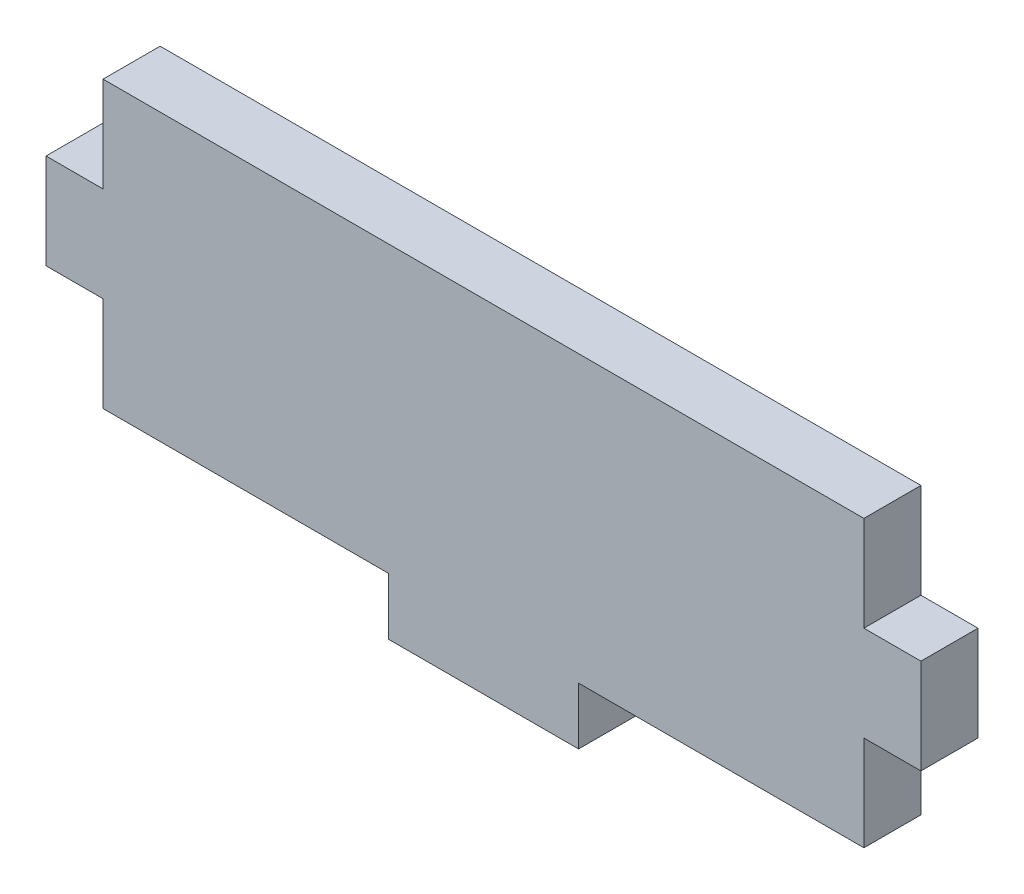
ISO-10303-21;
HEADER;
FILE_DESCRIPTION(('STEP AP214'),'2;1');
FILE_NAME('part.step','',(''),(''),'','','');
FILE_SCHEMA(('AUTOMOTIVE_DESIGN { 1 0 10303 214 1 1 1 1 }'));
ENDSEC;
DATA;
#1=APPLICATION_CONTEXT('core data for automotive mechanical design processes');
#2=APPLICATION_PROTOCOL_DEFINITION('international standard','automotive_design',2000,#1);
#3=PRODUCT_CONTEXT('',#1,'mechanical');
#4=PRODUCT('Part','Part','',(#3));
#5=PRODUCT_RELATED_PRODUCT_CATEGORY('part','',(#4));
#6=PRODUCT_DEFINITION_FORMATION('','',#4);
#7=PRODUCT_DEFINITION_CONTEXT('part definition',#1,'design');
#8=PRODUCT_DEFINITION('design','',#6,#7);
#9=PRODUCT_DEFINITION_SHAPE('','',#8);
#10=(LENGTH_UNIT() NAMED_UNIT(*) SI_UNIT(.MILLI.,.METRE.));
#11=(NAMED_UNIT(*) PLANE_ANGLE_UNIT() SI_UNIT($,.RADIAN.));
#12=(NAMED_UNIT(*) SI_UNIT($,.STERADIAN.) SOLID_ANGLE_UNIT());
#13=UNCERTAINTY_MEASURE_WITH_UNIT(LENGTH_MEASURE(1.E-05),#10,'distance_accuracy_value','');
#14=(GEOMETRIC_REPRESENTATION_CONTEXT(3) GLOBAL_UNCERTAINTY_ASSIGNED_CONTEXT((#13)) GLOBAL_UNIT_ASSIGNED_CONTEXT((#10,
#11,#12)) REPRESENTATION_CONTEXT('',''));
#15=CARTESIAN_POINT('',(0.,0.,0.));
#16=DIRECTION('',(0.,0.,1.));
#17=DIRECTION('',(1.,0.,0.));
#18=AXIS2_PLACEMENT_3D('',#15,#16,#17);
#19=CARTESIAN_POINT('',(-2.9999999944,-2.9999999944,2.9999999944));
#20=DIRECTION('',(0.,0.,1.));
#21=DIRECTION('',(1.,0.,0.));
#22=AXIS2_PLACEMENT_3D('',#19,#20,#21);
#23=PLANE('',#22);
#24=DIRECTION('',(1.,0.,0.));
#25=VECTOR('',#24,1.);
#26=CARTESIAN_POINT('',(20.000000005,14.9999999974,2.9999999944));
#27=LINE('',#26,#25);
#28=CARTESIAN_POINT('',(-4.23912933835563E-09,14.9999999974,2.9999999944));
#29=VERTEX_POINT('',#28);
#30=CARTESIAN_POINT('',(40.0000000142391,14.9999999974,2.9999999944));
#31=VERTEX_POINT('',#30);
#32=EDGE_CURVE('E186',#29,#31,#27,.T.);
#33=ORIENTED_EDGE('',*,*,#32,.F.);
#34=DIRECTION('',(0.,1.,0.));
#35=VECTOR('',#34,1.);
#36=CARTESIAN_POINT('',(0.,12.4999999936,2.9999999944));
#37=LINE('',#36,#35);
#38=CARTESIAN_POINT('',(-4.23912933835563E-09,9.99999999273889,2.9999999944));
#39=VERTEX_POINT('',#38);
#40=EDGE_CURVE('E190',#39,#29,#37,.T.);
#41=ORIENTED_EDGE('',*,*,#40,.F.);
#42=DIRECTION('',(1.,0.,0.));
#43=VECTOR('',#42,1.);
#44=CARTESIAN_POINT('',(-1.4999999972,9.9999999898,2.9999999944));
#45=LINE('',#44,#43);
#46=CARTESIAN_POINT('',(-2.9999999944,9.99999999273889,2.9999999944));
#47=VERTEX_POINT('',#46);
#48=EDGE_CURVE('E194',#47,#39,#45,.T.);
#49=ORIENTED_EDGE('',*,*,#48,.F.);
#50=DIRECTION('',(0.,1.,0.));
#51=VECTOR('',#50,1.);
#52=CARTESIAN_POINT('',(-2.9999999944,7.4999999987,2.9999999944));
#53=LINE('',#52,#51);
#54=CARTESIAN_POINT('',(-2.9999999944,5.00000000077778,2.9999999944));
#55=VERTEX_POINT('',#54);
#56=EDGE_CURVE('E198',#55,#47,#53,.T.);
#57=ORIENTED_EDGE('',*,*,#56,.F.);
#58=DIRECTION('',(-1.,0.,0.));
#59=VECTOR('',#58,1.);
#60=CARTESIAN_POINT('',(-1.4999999972,5.0000000076,2.9999999944));
#61=LINE('',#60,#59);
#62=CARTESIAN_POINT('',(-2.11956466917781E-09,5.00000000418889,2.9999999944));
#63=VERTEX_POINT('',#62);
#64=EDGE_CURVE('E143',#63,#55,#61,.T.);
#65=ORIENTED_EDGE('',*,*,#64,.F.);
#66=DIRECTION('',(0.,1.,0.));
#67=VECTOR('',#66,1.);
#68=CARTESIAN_POINT('',(0.,2.5000000038,2.9999999944));
#69=LINE('',#68,#67);
#70=CARTESIAN_POINT('',(-4.23912847099389E-09,5.11666609689237E-09,2.9999999944));
#71=VERTEX_POINT('',#70);
#72=EDGE_CURVE('E20',#71,#63,#69,.T.);
#73=ORIENTED_EDGE('',*,*,#72,.F.);
#74=DIRECTION('',(-1.,0.,0.));
#75=VECTOR('',#74,1.);
#76=CARTESIAN_POINT('',(7.4999999987,0.,2.9999999944));
#77=LINE('',#76,#75);
#78=CARTESIAN_POINT('',(15.0000000052652,5.11666696425411E-09,2.9999999944));
#79=VERTEX_POINT('',#78);
#80=EDGE_CURVE('E131',#79,#71,#77,.T.);
#81=ORIENTED_EDGE('',*,*,#80,.F.);
#82=DIRECTION('',(0.,1.,0.));
#83=VECTOR('',#82,1.);
#84=CARTESIAN_POINT('',(14.9999999974,-1.4999999972,2.9999999944));
#85=LINE('',#84,#83);
#86=CARTESIAN_POINT('',(15.0000000052652,-2.9999999944,2.9999999944));
#87=VERTEX_POINT('',#86);
#88=EDGE_CURVE('E126',#87,#79,#85,.T.);
#89=ORIENTED_EDGE('',*,*,#88,.F.);
#90=DIRECTION('',(-1.,0.,0.));
#91=VECTOR('',#90,1.);
#92=CARTESIAN_POINT('',(20.000000005,-2.9999999944,2.9999999944));
#93=LINE('',#92,#91);
#94=CARTESIAN_POINT('',(25.0000000047348,-2.9999999944,2.9999999944));
#95=VERTEX_POINT('',#94);
#96=EDGE_CURVE('E154',#95,#87,#93,.T.);
#97=ORIENTED_EDGE('',*,*,#96,.F.);
#98=DIRECTION('',(0.,-1.,0.));
#99=VECTOR('',#98,1.);
#100=CARTESIAN_POINT('',(25.0000000126,-1.4999999972,2.9999999944));
#101=LINE('',#100,#99);
#102=CARTESIAN_POINT('',(25.0000000047348,5.11666588005194E-09,2.9999999944));
#103=VERTEX_POINT('',#102);
#104=EDGE_CURVE('E158',#103,#95,#101,.T.);
#105=ORIENTED_EDGE('',*,*,#104,.F.);
#106=DIRECTION('',(-1.,0.,0.));
#107=VECTOR('',#106,1.);
#108=CARTESIAN_POINT('',(32.5000000113,0.,2.9999999944));
#109=LINE('',#108,#107);
#110=CARTESIAN_POINT('',(40.0000000142391,5.11666653057324E-09,2.9999999944));
#111=VERTEX_POINT('',#110);
#112=EDGE_CURVE('E162',#111,#103,#109,.T.);
#113=ORIENTED_EDGE('',*,*,#112,.F.);
#114=DIRECTION('',(0.,-1.,0.));
#115=VECTOR('',#114,1.);
#116=CARTESIAN_POINT('',(40.00000001,2.5000000038,2.9999999944));
#117=LINE('',#116,#115);
#118=CARTESIAN_POINT('',(40.0000000142391,5.00000000077778,2.9999999944));
#119=VERTEX_POINT('',#118);
#120=EDGE_CURVE('E166',#119,#111,#117,.T.);
#121=ORIENTED_EDGE('',*,*,#120,.F.);
#122=DIRECTION('',(-1.,0.,0.));
#123=VECTOR('',#122,1.);
#124=CARTESIAN_POINT('',(41.5000000072,5.0000000076,2.9999999944));
#125=LINE('',#124,#123);
#126=CARTESIAN_POINT('',(43.0000000044,5.00000000077778,2.9999999944));
#127=VERTEX_POINT('',#126);
#128=EDGE_CURVE('E170',#127,#119,#125,.T.);
#129=ORIENTED_EDGE('',*,*,#128,.F.);
#130=DIRECTION('',(0.,-1.,0.));
#131=VECTOR('',#130,1.);
#132=CARTESIAN_POINT('',(43.0000000044,7.4999999987,2.9999999944));
#133=LINE('',#132,#131);
#134=CARTESIAN_POINT('',(43.0000000044,9.99999999273889,2.9999999944));
#135=VERTEX_POINT('',#134);
#136=EDGE_CURVE('E174',#135,#127,#133,.T.);
#137=ORIENTED_EDGE('',*,*,#136,.F.);
#138=DIRECTION('',(1.,0.,0.));
#139=VECTOR('',#138,1.);
#140=CARTESIAN_POINT('',(41.5000000072,9.9999999898,2.9999999944));
#141=LINE('',#140,#139);
#142=CARTESIAN_POINT('',(40.0000000142391,9.99999999273889,2.9999999944));
#143=VERTEX_POINT('',#142);
#144=EDGE_CURVE('E178',#143,#135,#141,.T.);
#145=ORIENTED_EDGE('',*,*,#144,.F.);
#146=DIRECTION('',(0.,-1.,0.));
#147=VECTOR('',#146,1.);
#148=CARTESIAN_POINT('',(40.00000001,12.4999999936,2.9999999944));
#149=LINE('',#148,#147);
#150=EDGE_CURVE('E182',#31,#143,#149,.T.);
#151=ORIENTED_EDGE('',*,*,#150,.F.);
#152=EDGE_LOOP('',(#33,#41,#49,#57,#65,#73,#81,#89,#97,#105,#113,#121,#129,#137,#145,#151));
#153=FACE_BOUND('',#152,.T.);
#154=ADVANCED_FACE('F16',(#153),#23,.T.);
#155=CARTESIAN_POINT('',(0.,0.,0.));
#156=DIRECTION('',(-1.,0.,0.));
#157=DIRECTION('',(0.,0.,1.));
#158=AXIS2_PLACEMENT_3D('',#155,#156,#157);
#159=PLANE('',#158);
#160=ORIENTED_EDGE('',*,*,#72,.T.);
#161=DIRECTION('',(0.,0.,1.));
#162=VECTOR('',#161,1.);
#163=CARTESIAN_POINT('',(0.,5.0000000076,1.4999999972));
#164=LINE('',#163,#162);
#165=CARTESIAN_POINT('',(-2.11956423549695E-09,5.00000000418889,0.));
#166=VERTEX_POINT('',#165);
#167=EDGE_CURVE('E202',#166,#63,#164,.T.);
#168=ORIENTED_EDGE('',*,*,#167,.F.);
#169=DIRECTION('',(0.,-1.,0.));
#170=VECTOR('',#169,1.);
#171=CARTESIAN_POINT('',(-8.47826106195604E-09,6.0000000015,0.));
#172=LINE('',#171,#170);
#173=CARTESIAN_POINT('',(-2.11956423549695E-09,2.55833304844619E-09,0.));
#174=VERTEX_POINT('',#173);
#175=EDGE_CURVE('E149',#166,#174,#172,.T.);
#176=ORIENTED_EDGE('',*,*,#175,.T.);
#177=DIRECTION('',(0.,0.,-1.));
#178=VECTOR('',#177,1.);
#179=CARTESIAN_POINT('',(0.,0.,1.4999999972));
#180=LINE('',#179,#178);
#181=EDGE_CURVE('E136',#71,#174,#180,.T.);
#182=ORIENTED_EDGE('',*,*,#181,.F.);
#183=EDGE_LOOP('',(#160,#168,#176,#182));
#184=FACE_BOUND('',#183,.T.);
#185=ADVANCED_FACE('F148',(#184),#159,.T.);
#186=CARTESIAN_POINT('',(0.,0.,2.9999999944));
#187=DIRECTION('',(0.,-1.,0.));
#188=DIRECTION('',(0.,0.,-1.));
#189=AXIS2_PLACEMENT_3D('',#186,#187,#188);
#190=PLANE('',#189);
#191=ORIENTED_EDGE('',*,*,#80,.T.);
#192=ORIENTED_EDGE('',*,*,#181,.T.);
#193=DIRECTION('',(1.,0.,0.));
#194=VECTOR('',#193,1.);
#195=CARTESIAN_POINT('',(20.000000005,1.02333328443061E-08,0.));
#196=LINE('',#195,#194);
#197=CARTESIAN_POINT('',(15.0000000013326,2.55833348212706E-09,0.));
#198=VERTEX_POINT('',#197);
#199=EDGE_CURVE('E207',#174,#198,#196,.T.);
#200=ORIENTED_EDGE('',*,*,#199,.T.);
#201=DIRECTION('',(0.,0.,-1.));
#202=VECTOR('',#201,1.);
#203=CARTESIAN_POINT('',(14.9999999974,0.,1.4999999972));
#204=LINE('',#203,#202);
#205=EDGE_CURVE('E138',#79,#198,#204,.T.);
#206=ORIENTED_EDGE('',*,*,#205,.F.);
#207=EDGE_LOOP('',(#191,#192,#200,#206));
#208=FACE_BOUND('',#207,.T.);
#209=ADVANCED_FACE('F133',(#208),#190,.T.);
#210=CARTESIAN_POINT('',(14.9999999974,-2.9999999944,0.));
#211=DIRECTION('',(-1.,0.,0.));
#212=DIRECTION('',(0.,0.,1.));
#213=AXIS2_PLACEMENT_3D('',#210,#211,#212);
#214=PLANE('',#213);
#215=ORIENTED_EDGE('',*,*,#88,.T.);
#216=ORIENTED_EDGE('',*,*,#205,.T.);
#217=DIRECTION('',(0.,-1.,0.));
#218=VECTOR('',#217,1.);
#219=CARTESIAN_POINT('',(15.0000000131304,6.0000000015,0.));
#220=LINE('',#219,#218);
#221=CARTESIAN_POINT('',(15.0000000013326,-2.9999999944,0.));
#222=VERTEX_POINT('',#221);
#223=EDGE_CURVE('E209',#198,#222,#220,.T.);
#224=ORIENTED_EDGE('',*,*,#223,.T.);
#225=DIRECTION('',(0.,0.,-1.));
#226=VECTOR('',#225,1.);
#227=CARTESIAN_POINT('',(14.9999999974,-2.9999999944,1.4999999972));
#228=LINE('',#227,#226);
#229=EDGE_CURVE('E156',#87,#222,#228,.T.);
#230=ORIENTED_EDGE('',*,*,#229,.F.);
#231=EDGE_LOOP('',(#215,#216,#224,#230));
#232=FACE_BOUND('',#231,.T.);
#233=ADVANCED_FACE('F305',(#232),#214,.T.);
#234=CARTESIAN_POINT('',(14.9999999974,-2.9999999944,2.9999999944));
#235=DIRECTION('',(0.,-1.,0.));
#236=DIRECTION('',(0.,0.,-1.));
#237=AXIS2_PLACEMENT_3D('',#234,#235,#236);
#238=PLANE('',#237);
#239=ORIENTED_EDGE('',*,*,#96,.T.);
#240=ORIENTED_EDGE('',*,*,#229,.T.);
#241=DIRECTION('',(1.,0.,0.));
#242=VECTOR('',#241,1.);
#243=CARTESIAN_POINT('',(20.000000005,-2.9999999944,0.));
#244=LINE('',#243,#242);
#245=CARTESIAN_POINT('',(25.0000000086674,-2.9999999944,0.));
#246=VERTEX_POINT('',#245);
#247=EDGE_CURVE('E212',#222,#246,#244,.T.);
#248=ORIENTED_EDGE('',*,*,#247,.T.);
#249=DIRECTION('',(0.,0.,-1.));
#250=VECTOR('',#249,1.);
#251=CARTESIAN_POINT('',(25.0000000126,-2.9999999944,1.4999999972));
#252=LINE('',#251,#250);
#253=EDGE_CURVE('E160',#95,#246,#252,.T.);
#254=ORIENTED_EDGE('',*,*,#253,.F.);
#255=EDGE_LOOP('',(#239,#240,#248,#254));
#256=FACE_BOUND('',#255,.T.);
#257=ADVANCED_FACE('F304',(#256),#238,.T.);
#258=CARTESIAN_POINT('',(25.0000000126,-2.9999999944,2.9999999944));
#259=DIRECTION('',(1.,0.,0.));
#260=DIRECTION('',(0.,0.,-1.));
#261=AXIS2_PLACEMENT_3D('',#258,#259,#260);
#262=PLANE('',#261);
#263=ORIENTED_EDGE('',*,*,#104,.T.);
#264=ORIENTED_EDGE('',*,*,#253,.T.);
#265=DIRECTION('',(0.,1.,0.));
#266=VECTOR('',#265,1.);
#267=CARTESIAN_POINT('',(24.9999999968696,6.0000000015,0.));
#268=LINE('',#267,#266);
#269=CARTESIAN_POINT('',(25.0000000086674,2.55833294002597E-09,0.));
#270=VERTEX_POINT('',#269);
#271=EDGE_CURVE('E215',#246,#270,#268,.T.);
#272=ORIENTED_EDGE('',*,*,#271,.T.);
#273=DIRECTION('',(0.,0.,-1.));
#274=VECTOR('',#273,1.);
#275=CARTESIAN_POINT('',(25.0000000126,0.,1.4999999972));
#276=LINE('',#275,#274);
#277=EDGE_CURVE('E164',#103,#270,#276,.T.);
#278=ORIENTED_EDGE('',*,*,#277,.F.);
#279=EDGE_LOOP('',(#263,#264,#272,#278));
#280=FACE_BOUND('',#279,.T.);
#281=ADVANCED_FACE('F298',(#280),#262,.T.);
#282=CARTESIAN_POINT('',(25.0000000126,0.,2.9999999944));
#283=DIRECTION('',(0.,-1.,0.));
#284=DIRECTION('',(0.,0.,-1.));
#285=AXIS2_PLACEMENT_3D('',#282,#283,#284);
#286=PLANE('',#285);
#287=ORIENTED_EDGE('',*,*,#112,.T.);
#288=ORIENTED_EDGE('',*,*,#277,.T.);
#289=DIRECTION('',(1.,0.,0.));
#290=VECTOR('',#289,1.);
#291=CARTESIAN_POINT('',(20.000000005,1.02333328443061E-08,0.));
#292=LINE('',#291,#290);
#293=CARTESIAN_POINT('',(40.0000000121196,2.55833326528662E-09,0.));
#294=VERTEX_POINT('',#293);
#295=EDGE_CURVE('E218',#270,#294,#292,.T.);
#296=ORIENTED_EDGE('',*,*,#295,.T.);
#297=DIRECTION('',(0.,0.,-1.));
#298=VECTOR('',#297,1.);
#299=CARTESIAN_POINT('',(40.00000001,0.,1.4999999972));
#300=LINE('',#299,#298);
#301=EDGE_CURVE('E168',#111,#294,#300,.T.);
#302=ORIENTED_EDGE('',*,*,#301,.F.);
#303=EDGE_LOOP('',(#287,#288,#296,#302));
#304=FACE_BOUND('',#303,.T.);
#305=ADVANCED_FACE('F294',(#304),#286,.T.);
#306=CARTESIAN_POINT('',(40.00000001,0.,2.9999999944));
#307=DIRECTION('',(1.,0.,0.));
#308=DIRECTION('',(0.,0.,-1.));
#309=AXIS2_PLACEMENT_3D('',#306,#307,#308);
#310=PLANE('',#309);
#311=ORIENTED_EDGE('',*,*,#120,.T.);
#312=ORIENTED_EDGE('',*,*,#301,.T.);
#313=DIRECTION('',(0.,1.,0.));
#314=VECTOR('',#313,1.);
#315=CARTESIAN_POINT('',(40.0000000184783,6.0000000015,0.));
#316=LINE('',#315,#314);
#317=CARTESIAN_POINT('',(40.0000000121196,5.00000000418889,0.));
#318=VERTEX_POINT('',#317);
#319=EDGE_CURVE('E221',#294,#318,#316,.T.);
#320=ORIENTED_EDGE('',*,*,#319,.T.);
#321=DIRECTION('',(0.,0.,-1.));
#322=VECTOR('',#321,1.);
#323=CARTESIAN_POINT('',(40.00000001,5.0000000076,1.4999999972));
#324=LINE('',#323,#322);
#325=EDGE_CURVE('E172',#119,#318,#324,.T.);
#326=ORIENTED_EDGE('',*,*,#325,.F.);
#327=EDGE_LOOP('',(#311,#312,#320,#326));
#328=FACE_BOUND('',#327,.T.);
#329=ADVANCED_FACE('F288',(#328),#310,.T.);
#330=CARTESIAN_POINT('',(40.00000001,5.0000000076,0.));
#331=DIRECTION('',(0.,-1.,0.));
#332=DIRECTION('',(1.,0.,0.));
#333=AXIS2_PLACEMENT_3D('',#330,#331,#332);
#334=PLANE('',#333);
#335=ORIENTED_EDGE('',*,*,#128,.T.);
#336=ORIENTED_EDGE('',*,*,#325,.T.);
#337=DIRECTION('',(1.,0.,0.));
#338=VECTOR('',#337,1.);
#339=CARTESIAN_POINT('',(20.000000005,4.99999999395556,0.));
#340=LINE('',#339,#338);
#341=CARTESIAN_POINT('',(43.0000000044,5.00000000418889,0.));
#342=VERTEX_POINT('',#341);
#343=EDGE_CURVE('E224',#318,#342,#340,.T.);
#344=ORIENTED_EDGE('',*,*,#343,.T.);
#345=DIRECTION('',(0.,0.,-1.));
#346=VECTOR('',#345,1.);
#347=CARTESIAN_POINT('',(43.0000000044,5.0000000076,1.4999999972));
#348=LINE('',#347,#346);
#349=EDGE_CURVE('E176',#127,#342,#348,.T.);
#350=ORIENTED_EDGE('',*,*,#349,.F.);
#351=EDGE_LOOP('',(#335,#336,#344,#350));
#352=FACE_BOUND('',#351,.T.);
#353=ADVANCED_FACE('F284',(#352),#334,.T.);
#354=CARTESIAN_POINT('',(43.0000000044,5.0000000076,0.));
#355=DIRECTION('',(1.,0.,0.));
#356=DIRECTION('',(0.,1.,0.));
#357=AXIS2_PLACEMENT_3D('',#354,#355,#356);
#358=PLANE('',#357);
#359=ORIENTED_EDGE('',*,*,#136,.T.);
#360=ORIENTED_EDGE('',*,*,#349,.T.);
#361=DIRECTION('',(0.,1.,0.));
#362=VECTOR('',#361,1.);
#363=CARTESIAN_POINT('',(43.0000000044,6.0000000015,0.));
#364=LINE('',#363,#362);
#365=CARTESIAN_POINT('',(43.0000000044,9.99999999126945,0.));
#366=VERTEX_POINT('',#365);
#367=EDGE_CURVE('E227',#342,#366,#364,.T.);
#368=ORIENTED_EDGE('',*,*,#367,.T.);
#369=DIRECTION('',(0.,0.,-1.));
#370=VECTOR('',#369,1.);
#371=CARTESIAN_POINT('',(43.0000000044,9.9999999898,1.4999999972));
#372=LINE('',#371,#370);
#373=EDGE_CURVE('E180',#135,#366,#372,.T.);
#374=ORIENTED_EDGE('',*,*,#373,.F.);
#375=EDGE_LOOP('',(#359,#360,#368,#374));
#376=FACE_BOUND('',#375,.T.);
#377=ADVANCED_FACE('F278',(#376),#358,.T.);
#378=CARTESIAN_POINT('',(40.00000001,9.9999999898,0.));
#379=DIRECTION('',(0.,1.,0.));
#380=DIRECTION('',(0.,0.,1.));
#381=AXIS2_PLACEMENT_3D('',#378,#379,#380);
#382=PLANE('',#381);
#383=ORIENTED_EDGE('',*,*,#144,.T.);
#384=ORIENTED_EDGE('',*,*,#373,.T.);
#385=DIRECTION('',(-1.,0.,0.));
#386=VECTOR('',#385,1.);
#387=CARTESIAN_POINT('',(20.000000005,9.99999999567778,0.));
#388=LINE('',#387,#386);
#389=CARTESIAN_POINT('',(40.0000000121196,9.99999999126945,0.));
#390=VERTEX_POINT('',#389);
#391=EDGE_CURVE('E230',#366,#390,#388,.T.);
#392=ORIENTED_EDGE('',*,*,#391,.T.);
#393=DIRECTION('',(0.,0.,-1.));
#394=VECTOR('',#393,1.);
#395=CARTESIAN_POINT('',(40.00000001,9.9999999898,1.4999999972));
#396=LINE('',#395,#394);
#397=EDGE_CURVE('E184',#143,#390,#396,.T.);
#398=ORIENTED_EDGE('',*,*,#397,.F.);
#399=EDGE_LOOP('',(#383,#384,#392,#398));
#400=FACE_BOUND('',#399,.T.);
#401=ADVANCED_FACE('F274',(#400),#382,.T.);
#402=CARTESIAN_POINT('',(40.00000001,9.9999999898,2.9999999944));
#403=DIRECTION('',(1.,0.,0.));
#404=DIRECTION('',(0.,0.,-1.));
#405=AXIS2_PLACEMENT_3D('',#402,#403,#404);
#406=PLANE('',#405);
#407=ORIENTED_EDGE('',*,*,#150,.T.);
#408=ORIENTED_EDGE('',*,*,#397,.T.);
#409=DIRECTION('',(0.,1.,0.));
#410=VECTOR('',#409,1.);
#411=CARTESIAN_POINT('',(40.0000000184783,6.0000000015,0.));
#412=LINE('',#411,#410);
#413=CARTESIAN_POINT('',(40.0000000121196,14.9999999974,0.));
#414=VERTEX_POINT('',#413);
#415=EDGE_CURVE('E233',#390,#414,#412,.T.);
#416=ORIENTED_EDGE('',*,*,#415,.T.);
#417=DIRECTION('',(0.,0.,-1.));
#418=VECTOR('',#417,1.);
#419=CARTESIAN_POINT('',(40.00000001,14.9999999974,1.4999999972));
#420=LINE('',#419,#418);
#421=EDGE_CURVE('E188',#31,#414,#420,.T.);
#422=ORIENTED_EDGE('',*,*,#421,.F.);
#423=EDGE_LOOP('',(#407,#408,#416,#422));
#424=FACE_BOUND('',#423,.T.);
#425=ADVANCED_FACE('F268',(#424),#406,.T.);
#426=CARTESIAN_POINT('',(40.00000001,14.9999999974,0.));
#427=DIRECTION('',(0.,1.,0.));
#428=DIRECTION('',(-1.,0.,0.));
#429=AXIS2_PLACEMENT_3D('',#426,#427,#428);
#430=PLANE('',#429);
#431=ORIENTED_EDGE('',*,*,#32,.T.);
#432=ORIENTED_EDGE('',*,*,#421,.T.);
#433=DIRECTION('',(-1.,0.,0.));
#434=VECTOR('',#433,1.);
#435=CARTESIAN_POINT('',(20.000000005,14.9999999974,0.));
#436=LINE('',#435,#434);
#437=CARTESIAN_POINT('',(-2.11956466917781E-09,14.9999999974,0.));
#438=VERTEX_POINT('',#437);
#439=EDGE_CURVE('E236',#414,#438,#436,.T.);
#440=ORIENTED_EDGE('',*,*,#439,.T.);
#441=DIRECTION('',(0.,0.,-1.));
#442=VECTOR('',#441,1.);
#443=CARTESIAN_POINT('',(0.,14.9999999974,1.4999999972));
#444=LINE('',#443,#442);
#445=EDGE_CURVE('E192',#29,#438,#444,.T.);
#446=ORIENTED_EDGE('',*,*,#445,.F.);
#447=EDGE_LOOP('',(#431,#432,#440,#446));
#448=FACE_BOUND('',#447,.T.);
#449=ADVANCED_FACE('F264',(#448),#430,.T.);
#450=CARTESIAN_POINT('',(0.,14.9999999974,0.));
#451=DIRECTION('',(-1.,0.,0.));
#452=DIRECTION('',(0.,-1.,0.));
#453=AXIS2_PLACEMENT_3D('',#450,#451,#452);
#454=PLANE('',#453);
#455=ORIENTED_EDGE('',*,*,#40,.T.);
#456=ORIENTED_EDGE('',*,*,#445,.T.);
#457=DIRECTION('',(0.,-1.,0.));
#458=VECTOR('',#457,1.);
#459=CARTESIAN_POINT('',(-8.47826106195604E-09,6.0000000015,0.));
#460=LINE('',#459,#458);
#461=CARTESIAN_POINT('',(-2.11956423549695E-09,9.99999999126945,0.));
#462=VERTEX_POINT('',#461);
#463=EDGE_CURVE('E239',#438,#462,#460,.T.);
#464=ORIENTED_EDGE('',*,*,#463,.T.);
#465=DIRECTION('',(0.,0.,-1.));
#466=VECTOR('',#465,1.);
#467=CARTESIAN_POINT('',(0.,9.9999999898,1.4999999972));
#468=LINE('',#467,#466);
#469=EDGE_CURVE('E196',#39,#462,#468,.T.);
#470=ORIENTED_EDGE('',*,*,#469,.F.);
#471=EDGE_LOOP('',(#455,#456,#464,#470));
#472=FACE_BOUND('',#471,.T.);
#473=ADVANCED_FACE('F259',(#472),#454,.T.);
#474=CARTESIAN_POINT('',(0.,9.9999999898,0.));
#475=DIRECTION('',(0.,1.,0.));
#476=DIRECTION('',(-1.,0.,0.));
#477=AXIS2_PLACEMENT_3D('',#474,#475,#476);
#478=PLANE('',#477);
#479=ORIENTED_EDGE('',*,*,#48,.T.);
#480=ORIENTED_EDGE('',*,*,#469,.T.);
#481=DIRECTION('',(-1.,0.,0.));
#482=VECTOR('',#481,1.);
#483=CARTESIAN_POINT('',(20.000000005,9.99999999567778,0.));
#484=LINE('',#483,#482);
#485=CARTESIAN_POINT('',(-2.9999999944,9.99999999126945,0.));
#486=VERTEX_POINT('',#485);
#487=EDGE_CURVE('E242',#462,#486,#484,.T.);
#488=ORIENTED_EDGE('',*,*,#487,.T.);
#489=DIRECTION('',(0.,0.,-1.));
#490=VECTOR('',#489,1.);
#491=CARTESIAN_POINT('',(-2.9999999944,9.9999999898,1.4999999972));
#492=LINE('',#491,#490);
#493=EDGE_CURVE('E200',#47,#486,#492,.T.);
#494=ORIENTED_EDGE('',*,*,#493,.F.);
#495=EDGE_LOOP('',(#479,#480,#488,#494));
#496=FACE_BOUND('',#495,.T.);
#497=ADVANCED_FACE('F254',(#496),#478,.T.);
#498=CARTESIAN_POINT('',(-2.9999999944,5.0000000076,0.));
#499=DIRECTION('',(-1.,0.,0.));
#500=DIRECTION('',(0.,0.,1.));
#501=AXIS2_PLACEMENT_3D('',#498,#499,#500);
#502=PLANE('',#501);
#503=ORIENTED_EDGE('',*,*,#56,.T.);
#504=ORIENTED_EDGE('',*,*,#493,.T.);
#505=DIRECTION('',(0.,-1.,0.));
#506=VECTOR('',#505,1.);
#507=CARTESIAN_POINT('',(-2.9999999944,6.0000000015,0.));
#508=LINE('',#507,#506);
#509=CARTESIAN_POINT('',(-2.9999999944,5.00000000418889,0.));
#510=VERTEX_POINT('',#509);
#511=EDGE_CURVE('E26',#486,#510,#508,.T.);
#512=ORIENTED_EDGE('',*,*,#511,.T.);
#513=DIRECTION('',(0.,0.,-1.));
#514=VECTOR('',#513,1.);
#515=CARTESIAN_POINT('',(-2.9999999944,5.0000000076,1.4999999972));
#516=LINE('',#515,#514);
#517=EDGE_CURVE('E34',#55,#510,#516,.T.);
#518=ORIENTED_EDGE('',*,*,#517,.F.);
#519=EDGE_LOOP('',(#503,#504,#512,#518));
#520=FACE_BOUND('',#519,.T.);
#521=ADVANCED_FACE('F248',(#520),#502,.T.);
#522=CARTESIAN_POINT('',(-2.9999999944,5.0000000076,0.));
#523=DIRECTION('',(0.,-1.,0.));
#524=DIRECTION('',(1.,0.,0.));
#525=AXIS2_PLACEMENT_3D('',#522,#523,#524);
#526=PLANE('',#525);
#527=ORIENTED_EDGE('',*,*,#64,.T.);
#528=ORIENTED_EDGE('',*,*,#517,.T.);
#529=DIRECTION('',(1.,0.,0.));
#530=VECTOR('',#529,1.);
#531=CARTESIAN_POINT('',(20.000000005,4.99999999395556,0.));
#532=LINE('',#531,#530);
#533=EDGE_CURVE('E11',#510,#166,#532,.T.);
#534=ORIENTED_EDGE('',*,*,#533,.T.);
#535=ORIENTED_EDGE('',*,*,#167,.T.);
#536=EDGE_LOOP('',(#527,#528,#534,#535));
#537=FACE_BOUND('',#536,.T.);
#538=ADVANCED_FACE('F306',(#537),#526,.T.);
#539=CARTESIAN_POINT('',(-2.9999999944,-2.9999999944,0.));
#540=DIRECTION('',(0.,0.,1.));
#541=DIRECTION('',(1.,0.,0.));
#542=AXIS2_PLACEMENT_3D('',#539,#540,#541);
#543=PLANE('',#542);
#544=ORIENTED_EDGE('',*,*,#511,.F.);
#545=ORIENTED_EDGE('',*,*,#487,.F.);
#546=ORIENTED_EDGE('',*,*,#463,.F.);
#547=ORIENTED_EDGE('',*,*,#439,.F.);
#548=ORIENTED_EDGE('',*,*,#415,.F.);
#549=ORIENTED_EDGE('',*,*,#391,.F.);
#550=ORIENTED_EDGE('',*,*,#367,.F.);
#551=ORIENTED_EDGE('',*,*,#343,.F.);
#552=ORIENTED_EDGE('',*,*,#319,.F.);
#553=ORIENTED_EDGE('',*,*,#295,.F.);
#554=ORIENTED_EDGE('',*,*,#271,.F.);
#555=ORIENTED_EDGE('',*,*,#247,.F.);
#556=ORIENTED_EDGE('',*,*,#223,.F.);
#557=ORIENTED_EDGE('',*,*,#199,.F.);
#558=ORIENTED_EDGE('',*,*,#175,.F.);
#559=ORIENTED_EDGE('',*,*,#533,.F.);
#560=EDGE_LOOP('',(#544,#545,#546,#547,#548,#549,#550,#551,#552,#553,#554,#555,#556,#557,#558,#559));
#561=FACE_BOUND('',#560,.T.);
#562=ADVANCED_FACE('F18',(#561),#543,.F.);
#563=CLOSED_SHELL('',(#154,#185,#209,#233,#257,#281,#305,#329,#353,#377,#401,#425,#449,#473,
#497,#521,#538,#562));
#564=MANIFOLD_SOLID_BREP('B1',#563);
#565=ADVANCED_BREP_SHAPE_REPRESENTATION('',(#18,#564),#14);
#566=SHAPE_DEFINITION_REPRESENTATION(#9,#565);
ENDSEC;
END-ISO-10303-21;
